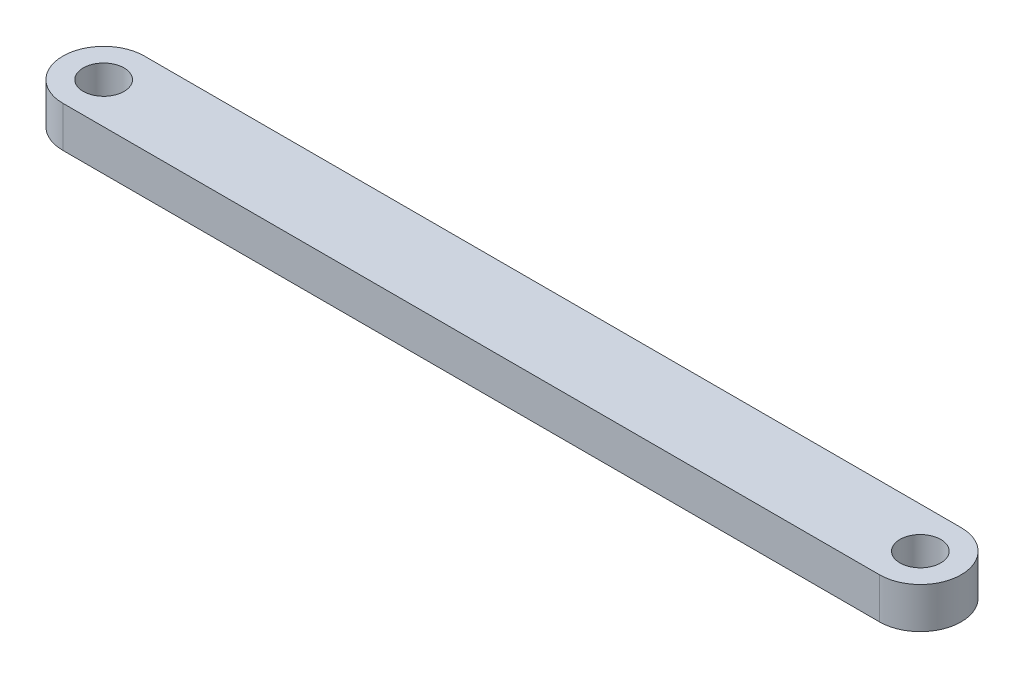
ISO-10303-21;
HEADER;
FILE_DESCRIPTION(('STEP AP214'),'2;1');
FILE_NAME('part.step','',(''),(''),'','','');
FILE_SCHEMA(('AUTOMOTIVE_DESIGN { 1 0 10303 214 1 1 1 1 }'));
ENDSEC;
DATA;
#1=APPLICATION_CONTEXT('core data for automotive mechanical design processes');
#2=APPLICATION_PROTOCOL_DEFINITION('international standard','automotive_design',2000,#1);
#3=PRODUCT_CONTEXT('',#1,'mechanical');
#4=PRODUCT('Part','Part','',(#3));
#5=PRODUCT_RELATED_PRODUCT_CATEGORY('part','',(#4));
#6=PRODUCT_DEFINITION_FORMATION('','',#4);
#7=PRODUCT_DEFINITION_CONTEXT('part definition',#1,'design');
#8=PRODUCT_DEFINITION('design','',#6,#7);
#9=PRODUCT_DEFINITION_SHAPE('','',#8);
#10=(LENGTH_UNIT() NAMED_UNIT(*) SI_UNIT(.MILLI.,.METRE.));
#11=(NAMED_UNIT(*) PLANE_ANGLE_UNIT() SI_UNIT($,.RADIAN.));
#12=(NAMED_UNIT(*) SI_UNIT($,.STERADIAN.) SOLID_ANGLE_UNIT());
#13=UNCERTAINTY_MEASURE_WITH_UNIT(LENGTH_MEASURE(1.E-05),#10,'distance_accuracy_value','');
#14=(GEOMETRIC_REPRESENTATION_CONTEXT(3) GLOBAL_UNCERTAINTY_ASSIGNED_CONTEXT((#13)) GLOBAL_UNIT_ASSIGNED_CONTEXT((#10,
#11,#12)) REPRESENTATION_CONTEXT('',''));
#15=CARTESIAN_POINT('',(0.,0.,0.));
#16=DIRECTION('',(0.,0.,1.));
#17=DIRECTION('',(1.,0.,0.));
#18=AXIS2_PLACEMENT_3D('',#15,#16,#17);
#19=CARTESIAN_POINT('',(0.,3.,0.));
#20=DIRECTION('',(0.,1.,0.));
#21=DIRECTION('',(0.,0.,1.));
#22=AXIS2_PLACEMENT_3D('',#19,#20,#21);
#23=PLANE('',#22);
#24=CARTESIAN_POINT('',(0.,3.,0.));
#25=DIRECTION('',(0.,1.,0.));
#26=DIRECTION('',(0.,0.,1.));
#27=AXIS2_PLACEMENT_3D('',#24,#25,#26);
#28=CIRCLE('',#27,1.5);
#29=CARTESIAN_POINT('',(0.,3.,1.5));
#30=VERTEX_POINT('',#29);
#31=EDGE_CURVE('E102',#30,#30,#28,.T.);
#32=ORIENTED_EDGE('',*,*,#31,.F.);
#33=EDGE_LOOP('',(#32));
#34=FACE_BOUND('',#33,.T.);
#35=CARTESIAN_POINT('',(0.,3.,0.));
#36=DIRECTION('',(0.,1.,0.));
#37=DIRECTION('',(0.,0.,1.));
#38=AXIS2_PLACEMENT_3D('',#35,#36,#37);
#39=CIRCLE('',#38,3.);
#40=CARTESIAN_POINT('',(0.,3.,3.));
#41=VERTEX_POINT('',#40);
#42=CARTESIAN_POINT('',(0.,3.,-3.));
#43=VERTEX_POINT('',#42);
#44=EDGE_CURVE('E87',#41,#43,#39,.T.);
#45=ORIENTED_EDGE('',*,*,#44,.T.);
#46=DIRECTION('',(-1.,0.,0.));
#47=VECTOR('',#46,1.);
#48=CARTESIAN_POINT('',(0.,3.,-3.));
#49=LINE('',#48,#47);
#50=CARTESIAN_POINT('',(-60.,3.,-3.00000000000001));
#51=VERTEX_POINT('',#50);
#52=EDGE_CURVE('E82',#43,#51,#49,.T.);
#53=ORIENTED_EDGE('',*,*,#52,.T.);
#54=CARTESIAN_POINT('',(-60.,3.,0.));
#55=DIRECTION('',(0.,1.,0.));
#56=DIRECTION('',(0.,0.,1.));
#57=AXIS2_PLACEMENT_3D('',#54,#55,#56);
#58=CIRCLE('',#57,3.00000000000001);
#59=CARTESIAN_POINT('',(-60.,3.,3.00000000000002));
#60=VERTEX_POINT('',#59);
#61=EDGE_CURVE('E85',#51,#60,#58,.T.);
#62=ORIENTED_EDGE('',*,*,#61,.T.);
#63=DIRECTION('',(1.,0.,0.));
#64=VECTOR('',#63,1.);
#65=CARTESIAN_POINT('',(0.,3.,3.));
#66=LINE('',#65,#64);
#67=EDGE_CURVE('E52',#60,#41,#66,.T.);
#68=ORIENTED_EDGE('',*,*,#67,.T.);
#69=EDGE_LOOP('',(#45,#53,#62,#68));
#70=FACE_BOUND('',#69,.T.);
#71=CARTESIAN_POINT('',(-60.,3.,0.));
#72=DIRECTION('',(0.,1.,0.));
#73=DIRECTION('',(0.,0.,1.));
#74=AXIS2_PLACEMENT_3D('',#71,#72,#73);
#75=CIRCLE('',#74,1.5);
#76=CARTESIAN_POINT('',(-60.,3.,1.50000000000001));
#77=VERTEX_POINT('',#76);
#78=EDGE_CURVE('E117',#77,#77,#75,.T.);
#79=ORIENTED_EDGE('',*,*,#78,.F.);
#80=EDGE_LOOP('',(#79));
#81=FACE_BOUND('',#80,.T.);
#82=ADVANCED_FACE('F35',(#34,#70,#81),#23,.T.);
#83=CARTESIAN_POINT('',(0.,0.,0.));
#84=DIRECTION('',(0.,1.,0.));
#85=DIRECTION('',(0.,0.,1.));
#86=AXIS2_PLACEMENT_3D('',#83,#84,#85);
#87=PLANE('',#86);
#88=CARTESIAN_POINT('',(0.,0.,0.));
#89=DIRECTION('',(0.,1.,0.));
#90=DIRECTION('',(0.,0.,1.));
#91=AXIS2_PLACEMENT_3D('',#88,#89,#90);
#92=CIRCLE('',#91,3.);
#93=CARTESIAN_POINT('',(0.,0.,3.));
#94=VERTEX_POINT('',#93);
#95=CARTESIAN_POINT('',(0.,0.,-3.));
#96=VERTEX_POINT('',#95);
#97=EDGE_CURVE('E99',#94,#96,#92,.T.);
#98=ORIENTED_EDGE('',*,*,#97,.F.);
#99=DIRECTION('',(1.,0.,0.));
#100=VECTOR('',#99,1.);
#101=CARTESIAN_POINT('',(0.,0.,3.));
#102=LINE('',#101,#100);
#103=CARTESIAN_POINT('',(-60.,0.,3.00000000000002));
#104=VERTEX_POINT('',#103);
#105=EDGE_CURVE('E75',#104,#94,#102,.T.);
#106=ORIENTED_EDGE('',*,*,#105,.F.);
#107=CARTESIAN_POINT('',(-60.,0.,0.));
#108=DIRECTION('',(0.,1.,0.));
#109=DIRECTION('',(0.,0.,1.));
#110=AXIS2_PLACEMENT_3D('',#107,#108,#109);
#111=CIRCLE('',#110,3.00000000000001);
#112=CARTESIAN_POINT('',(-60.,0.,-3.00000000000001));
#113=VERTEX_POINT('',#112);
#114=EDGE_CURVE('E69',#113,#104,#111,.T.);
#115=ORIENTED_EDGE('',*,*,#114,.F.);
#116=DIRECTION('',(-1.,0.,0.));
#117=VECTOR('',#116,1.);
#118=CARTESIAN_POINT('',(0.,0.,-3.));
#119=LINE('',#118,#117);
#120=EDGE_CURVE('E91',#96,#113,#119,.T.);
#121=ORIENTED_EDGE('',*,*,#120,.F.);
#122=EDGE_LOOP('',(#98,#106,#115,#121));
#123=FACE_BOUND('',#122,.T.);
#124=CARTESIAN_POINT('',(0.,0.,0.));
#125=DIRECTION('',(0.,1.,0.));
#126=DIRECTION('',(0.,0.,1.));
#127=AXIS2_PLACEMENT_3D('',#124,#125,#126);
#128=CIRCLE('',#127,1.5);
#129=CARTESIAN_POINT('',(0.,0.,1.5));
#130=VERTEX_POINT('',#129);
#131=EDGE_CURVE('E114',#130,#130,#128,.T.);
#132=ORIENTED_EDGE('',*,*,#131,.T.);
#133=EDGE_LOOP('',(#132));
#134=FACE_BOUND('',#133,.T.);
#135=CARTESIAN_POINT('',(-60.,0.,0.));
#136=DIRECTION('',(0.,1.,0.));
#137=DIRECTION('',(0.,0.,1.));
#138=AXIS2_PLACEMENT_3D('',#135,#136,#137);
#139=CIRCLE('',#138,1.5);
#140=CARTESIAN_POINT('',(-60.,0.,1.50000000000001));
#141=VERTEX_POINT('',#140);
#142=EDGE_CURVE('E120',#141,#141,#139,.T.);
#143=ORIENTED_EDGE('',*,*,#142,.T.);
#144=EDGE_LOOP('',(#143));
#145=FACE_BOUND('',#144,.T.);
#146=ADVANCED_FACE('F110',(#123,#134,#145),#87,.F.);
#147=CARTESIAN_POINT('',(0.,3.,0.));
#148=DIRECTION('',(0.,-1.,0.));
#149=DIRECTION('',(0.,0.,-1.));
#150=AXIS2_PLACEMENT_3D('',#147,#148,#149);
#151=CYLINDRICAL_SURFACE('',#150,3.);
#152=ORIENTED_EDGE('',*,*,#97,.T.);
#153=DIRECTION('',(0.,-1.,0.));
#154=VECTOR('',#153,1.);
#155=CARTESIAN_POINT('',(0.,3.,-3.));
#156=LINE('',#155,#154);
#157=EDGE_CURVE('E11',#43,#96,#156,.T.);
#158=ORIENTED_EDGE('',*,*,#157,.F.);
#159=ORIENTED_EDGE('',*,*,#44,.F.);
#160=DIRECTION('',(0.,-1.,0.));
#161=VECTOR('',#160,1.);
#162=CARTESIAN_POINT('',(0.,3.,3.));
#163=LINE('',#162,#161);
#164=EDGE_CURVE('E95',#41,#94,#163,.T.);
#165=ORIENTED_EDGE('',*,*,#164,.T.);
#166=EDGE_LOOP('',(#152,#158,#159,#165));
#167=FACE_BOUND('',#166,.T.);
#168=ADVANCED_FACE('F37',(#167),#151,.T.);
#169=CARTESIAN_POINT('',(0.,3.,-3.));
#170=DIRECTION('',(0.,0.,1.));
#171=DIRECTION('',(1.,0.,0.));
#172=AXIS2_PLACEMENT_3D('',#169,#170,#171);
#173=PLANE('',#172);
#174=ORIENTED_EDGE('',*,*,#120,.T.);
#175=DIRECTION('',(0.,-1.,0.));
#176=VECTOR('',#175,1.);
#177=CARTESIAN_POINT('',(-60.,3.,-3.00000000000001));
#178=LINE('',#177,#176);
#179=EDGE_CURVE('E44',#51,#113,#178,.T.);
#180=ORIENTED_EDGE('',*,*,#179,.F.);
#181=ORIENTED_EDGE('',*,*,#52,.F.);
#182=ORIENTED_EDGE('',*,*,#157,.T.);
#183=EDGE_LOOP('',(#174,#180,#181,#182));
#184=FACE_BOUND('',#183,.T.);
#185=ADVANCED_FACE('F90',(#184),#173,.F.);
#186=CARTESIAN_POINT('',(-60.,3.,0.));
#187=DIRECTION('',(0.,-1.,0.));
#188=DIRECTION('',(0.,0.,-1.));
#189=AXIS2_PLACEMENT_3D('',#186,#187,#188);
#190=CYLINDRICAL_SURFACE('',#189,3.00000000000001);
#191=ORIENTED_EDGE('',*,*,#114,.T.);
#192=DIRECTION('',(0.,-1.,0.));
#193=VECTOR('',#192,1.);
#194=CARTESIAN_POINT('',(-60.,3.,3.00000000000002));
#195=LINE('',#194,#193);
#196=EDGE_CURVE('E92',#60,#104,#195,.T.);
#197=ORIENTED_EDGE('',*,*,#196,.F.);
#198=ORIENTED_EDGE('',*,*,#61,.F.);
#199=ORIENTED_EDGE('',*,*,#179,.T.);
#200=EDGE_LOOP('',(#191,#197,#198,#199));
#201=FACE_BOUND('',#200,.T.);
#202=ADVANCED_FACE('F93',(#201),#190,.T.);
#203=CARTESIAN_POINT('',(0.,3.,3.));
#204=DIRECTION('',(0.,0.,-1.));
#205=DIRECTION('',(-1.,0.,0.));
#206=AXIS2_PLACEMENT_3D('',#203,#204,#205);
#207=PLANE('',#206);
#208=ORIENTED_EDGE('',*,*,#105,.T.);
#209=ORIENTED_EDGE('',*,*,#164,.F.);
#210=ORIENTED_EDGE('',*,*,#67,.F.);
#211=ORIENTED_EDGE('',*,*,#196,.T.);
#212=EDGE_LOOP('',(#208,#209,#210,#211));
#213=FACE_BOUND('',#212,.T.);
#214=ADVANCED_FACE('F107',(#213),#207,.F.);
#215=CARTESIAN_POINT('',(0.,3.,0.));
#216=DIRECTION('',(0.,-1.,0.));
#217=DIRECTION('',(0.,0.,-1.));
#218=AXIS2_PLACEMENT_3D('',#215,#216,#217);
#219=CYLINDRICAL_SURFACE('',#218,1.5);
#220=ORIENTED_EDGE('',*,*,#31,.T.);
#221=EDGE_LOOP('',(#220));
#222=FACE_BOUND('',#221,.T.);
#223=ORIENTED_EDGE('',*,*,#131,.F.);
#224=EDGE_LOOP('',(#223));
#225=FACE_BOUND('',#224,.T.);
#226=ADVANCED_FACE('F137',(#222,#225),#219,.F.);
#227=CARTESIAN_POINT('',(-60.,3.,0.));
#228=DIRECTION('',(0.,-1.,0.));
#229=DIRECTION('',(0.,0.,-1.));
#230=AXIS2_PLACEMENT_3D('',#227,#228,#229);
#231=CYLINDRICAL_SURFACE('',#230,1.5);
#232=ORIENTED_EDGE('',*,*,#78,.T.);
#233=EDGE_LOOP('',(#232));
#234=FACE_BOUND('',#233,.T.);
#235=ORIENTED_EDGE('',*,*,#142,.F.);
#236=EDGE_LOOP('',(#235));
#237=FACE_BOUND('',#236,.T.);
#238=ADVANCED_FACE('F126',(#234,#237),#231,.F.);
#239=CLOSED_SHELL('',(#82,#146,#168,#185,#202,#214,#226,#238));
#240=MANIFOLD_SOLID_BREP('B2',#239);
#241=ADVANCED_BREP_SHAPE_REPRESENTATION('',(#18,#240),#14);
#242=SHAPE_DEFINITION_REPRESENTATION(#9,#241);
ENDSEC;
END-ISO-10303-21;
